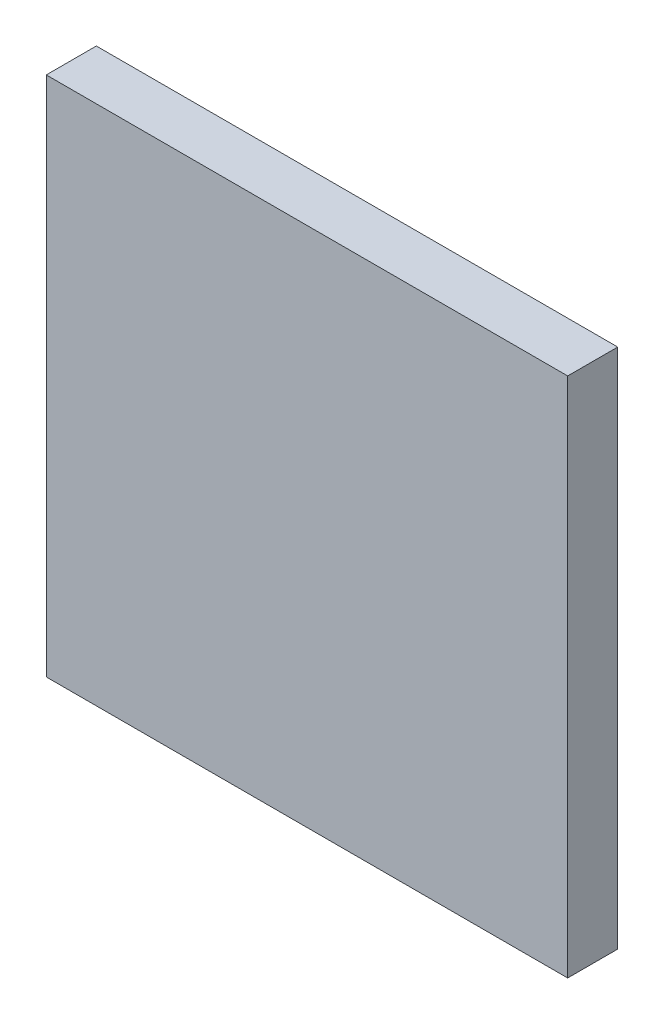
ISO-10303-21;
HEADER;
FILE_DESCRIPTION(('STEP AP214'),'2;1');
FILE_NAME('part.step','',(''),(''),'','','');
FILE_SCHEMA(('AUTOMOTIVE_DESIGN { 1 0 10303 214 1 1 1 1 }'));
ENDSEC;
DATA;
#1=APPLICATION_CONTEXT('core data for automotive mechanical design processes');
#2=APPLICATION_PROTOCOL_DEFINITION('international standard','automotive_design',2000,#1);
#3=PRODUCT_CONTEXT('',#1,'mechanical');
#4=PRODUCT('Part','Part','',(#3));
#5=PRODUCT_RELATED_PRODUCT_CATEGORY('part','',(#4));
#6=PRODUCT_DEFINITION_FORMATION('','',#4);
#7=PRODUCT_DEFINITION_CONTEXT('part definition',#1,'design');
#8=PRODUCT_DEFINITION('design','',#6,#7);
#9=PRODUCT_DEFINITION_SHAPE('','',#8);
#10=(LENGTH_UNIT() NAMED_UNIT(*) SI_UNIT(.MILLI.,.METRE.));
#11=(NAMED_UNIT(*) PLANE_ANGLE_UNIT() SI_UNIT($,.RADIAN.));
#12=(NAMED_UNIT(*) SI_UNIT($,.STERADIAN.) SOLID_ANGLE_UNIT());
#13=UNCERTAINTY_MEASURE_WITH_UNIT(LENGTH_MEASURE(1.E-05),#10,'distance_accuracy_value','');
#14=(GEOMETRIC_REPRESENTATION_CONTEXT(3) GLOBAL_UNCERTAINTY_ASSIGNED_CONTEXT((#13)) GLOBAL_UNIT_ASSIGNED_CONTEXT((#10,
#11,#12)) REPRESENTATION_CONTEXT('',''));
#15=CARTESIAN_POINT('',(0.,0.,0.));
#16=DIRECTION('',(0.,0.,1.));
#17=DIRECTION('',(1.,0.,0.));
#18=AXIS2_PLACEMENT_3D('',#15,#16,#17);
#19=CARTESIAN_POINT('',(0.,0.,4.8));
#20=DIRECTION('',(1.,0.,0.));
#21=DIRECTION('',(0.,0.,-1.));
#22=AXIS2_PLACEMENT_3D('',#19,#20,#21);
#23=PLANE('',#22);
#24=DIRECTION('',(0.,-1.,0.));
#25=VECTOR('',#24,1.);
#26=CARTESIAN_POINT('',(0.,0.,0.));
#27=LINE('',#26,#25);
#28=CARTESIAN_POINT('',(0.,50.,0.));
#29=VERTEX_POINT('',#28);
#30=CARTESIAN_POINT('',(0.,0.,0.));
#31=VERTEX_POINT('',#30);
#32=EDGE_CURVE('E107',#29,#31,#27,.T.);
#33=ORIENTED_EDGE('',*,*,#32,.T.);
#34=DIRECTION('',(0.,0.,-1.));
#35=VECTOR('',#34,1.);
#36=CARTESIAN_POINT('',(0.,0.,4.8));
#37=LINE('',#36,#35);
#38=CARTESIAN_POINT('',(0.,0.,4.8));
#39=VERTEX_POINT('',#38);
#40=EDGE_CURVE('E11',#39,#31,#37,.T.);
#41=ORIENTED_EDGE('',*,*,#40,.F.);
#42=DIRECTION('',(0.,-1.,0.));
#43=VECTOR('',#42,1.);
#44=CARTESIAN_POINT('',(0.,0.,4.8));
#45=LINE('',#44,#43);
#46=CARTESIAN_POINT('',(0.,50.,4.8));
#47=VERTEX_POINT('',#46);
#48=EDGE_CURVE('E91',#47,#39,#45,.T.);
#49=ORIENTED_EDGE('',*,*,#48,.F.);
#50=DIRECTION('',(0.,0.,-1.));
#51=VECTOR('',#50,1.);
#52=CARTESIAN_POINT('',(0.,50.,4.8));
#53=LINE('',#52,#51);
#54=EDGE_CURVE('E103',#47,#29,#53,.T.);
#55=ORIENTED_EDGE('',*,*,#54,.T.);
#56=EDGE_LOOP('',(#33,#41,#49,#55));
#57=FACE_BOUND('',#56,.T.);
#58=ADVANCED_FACE('F39',(#57),#23,.F.);
#59=CARTESIAN_POINT('',(0.,0.,4.8));
#60=DIRECTION('',(0.,1.,0.));
#61=DIRECTION('',(0.,0.,1.));
#62=AXIS2_PLACEMENT_3D('',#59,#60,#61);
#63=PLANE('',#62);
#64=DIRECTION('',(1.,0.,0.));
#65=VECTOR('',#64,1.);
#66=CARTESIAN_POINT('',(0.,0.,0.));
#67=LINE('',#66,#65);
#68=CARTESIAN_POINT('',(50.,0.,0.));
#69=VERTEX_POINT('',#68);
#70=EDGE_CURVE('E96',#31,#69,#67,.T.);
#71=ORIENTED_EDGE('',*,*,#70,.T.);
#72=DIRECTION('',(0.,0.,-1.));
#73=VECTOR('',#72,1.);
#74=CARTESIAN_POINT('',(50.,0.,4.8));
#75=LINE('',#74,#73);
#76=CARTESIAN_POINT('',(50.,0.,4.8));
#77=VERTEX_POINT('',#76);
#78=EDGE_CURVE('E48',#77,#69,#75,.T.);
#79=ORIENTED_EDGE('',*,*,#78,.F.);
#80=DIRECTION('',(1.,0.,0.));
#81=VECTOR('',#80,1.);
#82=CARTESIAN_POINT('',(0.,0.,4.8));
#83=LINE('',#82,#81);
#84=EDGE_CURVE('E86',#39,#77,#83,.T.);
#85=ORIENTED_EDGE('',*,*,#84,.F.);
#86=ORIENTED_EDGE('',*,*,#40,.T.);
#87=EDGE_LOOP('',(#71,#79,#85,#86));
#88=FACE_BOUND('',#87,.T.);
#89=ADVANCED_FACE('F95',(#88),#63,.F.);
#90=CARTESIAN_POINT('',(50.,0.,4.8));
#91=DIRECTION('',(-1.,0.,0.));
#92=DIRECTION('',(0.,0.,1.));
#93=AXIS2_PLACEMENT_3D('',#90,#91,#92);
#94=PLANE('',#93);
#95=DIRECTION('',(0.,1.,0.));
#96=VECTOR('',#95,1.);
#97=CARTESIAN_POINT('',(50.,0.,0.));
#98=LINE('',#97,#96);
#99=CARTESIAN_POINT('',(50.,50.,0.));
#100=VERTEX_POINT('',#99);
#101=EDGE_CURVE('E73',#69,#100,#98,.T.);
#102=ORIENTED_EDGE('',*,*,#101,.T.);
#103=DIRECTION('',(0.,0.,-1.));
#104=VECTOR('',#103,1.);
#105=CARTESIAN_POINT('',(50.,50.,4.8));
#106=LINE('',#105,#104);
#107=CARTESIAN_POINT('',(50.,50.,4.8));
#108=VERTEX_POINT('',#107);
#109=EDGE_CURVE('E98',#108,#100,#106,.T.);
#110=ORIENTED_EDGE('',*,*,#109,.F.);
#111=DIRECTION('',(0.,1.,0.));
#112=VECTOR('',#111,1.);
#113=CARTESIAN_POINT('',(50.,0.,4.8));
#114=LINE('',#113,#112);
#115=EDGE_CURVE('E89',#77,#108,#114,.T.);
#116=ORIENTED_EDGE('',*,*,#115,.F.);
#117=ORIENTED_EDGE('',*,*,#78,.T.);
#118=EDGE_LOOP('',(#102,#110,#116,#117));
#119=FACE_BOUND('',#118,.T.);
#120=ADVANCED_FACE('F99',(#119),#94,.F.);
#121=CARTESIAN_POINT('',(0.,50.,4.8));
#122=DIRECTION('',(0.,-1.,0.));
#123=DIRECTION('',(0.,0.,-1.));
#124=AXIS2_PLACEMENT_3D('',#121,#122,#123);
#125=PLANE('',#124);
#126=DIRECTION('',(-1.,0.,0.));
#127=VECTOR('',#126,1.);
#128=CARTESIAN_POINT('',(0.,50.,0.));
#129=LINE('',#128,#127);
#130=EDGE_CURVE('E79',#100,#29,#129,.T.);
#131=ORIENTED_EDGE('',*,*,#130,.T.);
#132=ORIENTED_EDGE('',*,*,#54,.F.);
#133=DIRECTION('',(-1.,0.,0.));
#134=VECTOR('',#133,1.);
#135=CARTESIAN_POINT('',(0.,50.,4.8));
#136=LINE('',#135,#134);
#137=EDGE_CURVE('E56',#108,#47,#136,.T.);
#138=ORIENTED_EDGE('',*,*,#137,.F.);
#139=ORIENTED_EDGE('',*,*,#109,.T.);
#140=EDGE_LOOP('',(#131,#132,#138,#139));
#141=FACE_BOUND('',#140,.T.);
#142=ADVANCED_FACE('F120',(#141),#125,.F.);
#143=CARTESIAN_POINT('',(0.,0.,4.8));
#144=DIRECTION('',(0.,0.,-1.));
#145=DIRECTION('',(-1.,0.,0.));
#146=AXIS2_PLACEMENT_3D('',#143,#144,#145);
#147=PLANE('',#146);
#148=ORIENTED_EDGE('',*,*,#48,.T.);
#149=ORIENTED_EDGE('',*,*,#84,.T.);
#150=ORIENTED_EDGE('',*,*,#115,.T.);
#151=ORIENTED_EDGE('',*,*,#137,.T.);
#152=EDGE_LOOP('',(#148,#149,#150,#151));
#153=FACE_BOUND('',#152,.T.);
#154=ADVANCED_FACE('F87',(#153),#147,.F.);
#155=CARTESIAN_POINT('',(0.,0.,0.));
#156=DIRECTION('',(0.,0.,-1.));
#157=DIRECTION('',(-1.,0.,0.));
#158=AXIS2_PLACEMENT_3D('',#155,#156,#157);
#159=PLANE('',#158);
#160=ORIENTED_EDGE('',*,*,#32,.F.);
#161=ORIENTED_EDGE('',*,*,#130,.F.);
#162=ORIENTED_EDGE('',*,*,#101,.F.);
#163=ORIENTED_EDGE('',*,*,#70,.F.);
#164=EDGE_LOOP('',(#160,#161,#162,#163));
#165=FACE_BOUND('',#164,.T.);
#166=ADVANCED_FACE('F123',(#165),#159,.T.);
#167=CLOSED_SHELL('',(#58,#89,#120,#142,#154,#166));
#168=MANIFOLD_SOLID_BREP('B2',#167);
#169=ADVANCED_BREP_SHAPE_REPRESENTATION('',(#18,#168),#14);
#170=SHAPE_DEFINITION_REPRESENTATION(#9,#169);
ENDSEC;
END-ISO-10303-21;
